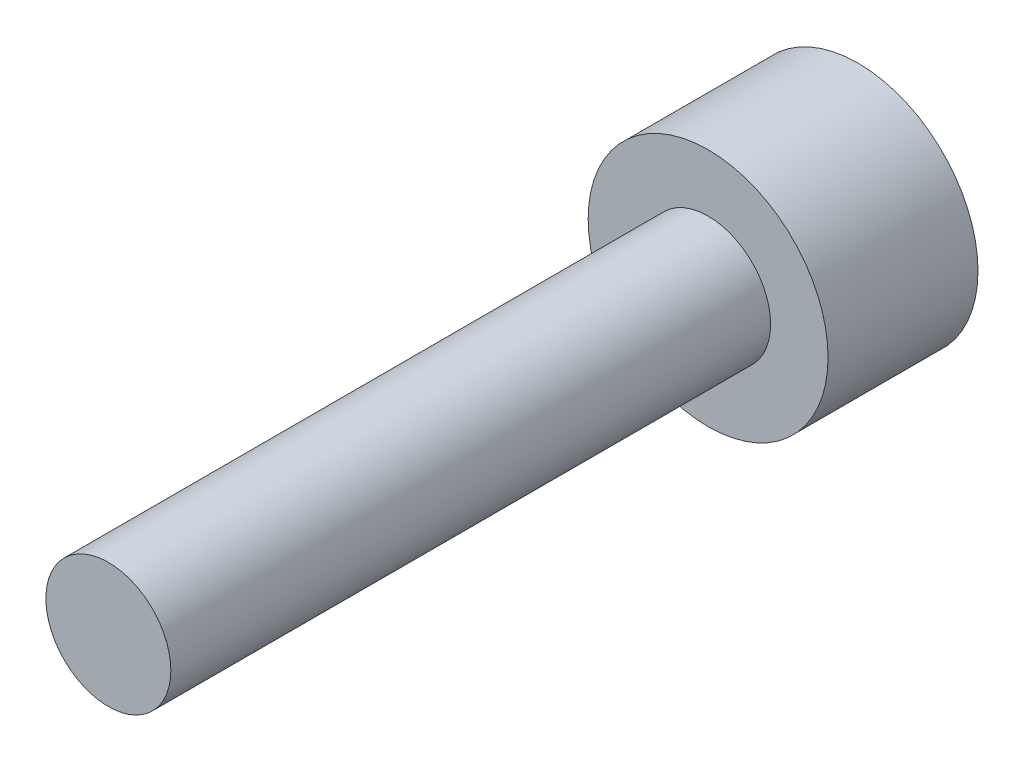
ISO-10303-21;
HEADER;
FILE_DESCRIPTION(('STEP AP214'),'2;1');
FILE_NAME('part.step','',(''),(''),'','','');
FILE_SCHEMA(('AUTOMOTIVE_DESIGN { 1 0 10303 214 1 1 1 1 }'));
ENDSEC;
DATA;
#1=APPLICATION_CONTEXT('core data for automotive mechanical design processes');
#2=APPLICATION_PROTOCOL_DEFINITION('international standard','automotive_design',2000,#1);
#3=PRODUCT_CONTEXT('',#1,'mechanical');
#4=PRODUCT('Part','Part','',(#3));
#5=PRODUCT_RELATED_PRODUCT_CATEGORY('part','',(#4));
#6=PRODUCT_DEFINITION_FORMATION('','',#4);
#7=PRODUCT_DEFINITION_CONTEXT('part definition',#1,'design');
#8=PRODUCT_DEFINITION('design','',#6,#7);
#9=PRODUCT_DEFINITION_SHAPE('','',#8);
#10=(LENGTH_UNIT() NAMED_UNIT(*) SI_UNIT(.MILLI.,.METRE.));
#11=(NAMED_UNIT(*) PLANE_ANGLE_UNIT() SI_UNIT($,.RADIAN.));
#12=(NAMED_UNIT(*) SI_UNIT($,.STERADIAN.) SOLID_ANGLE_UNIT());
#13=UNCERTAINTY_MEASURE_WITH_UNIT(LENGTH_MEASURE(1.E-05),#10,'distance_accuracy_value','');
#14=(GEOMETRIC_REPRESENTATION_CONTEXT(3) GLOBAL_UNCERTAINTY_ASSIGNED_CONTEXT((#13)) GLOBAL_UNIT_ASSIGNED_CONTEXT((#10,
#11,#12)) REPRESENTATION_CONTEXT('',''));
#15=CARTESIAN_POINT('',(0.,0.,0.));
#16=DIRECTION('',(0.,0.,1.));
#17=DIRECTION('',(1.,0.,0.));
#18=AXIS2_PLACEMENT_3D('',#15,#16,#17);
#19=CARTESIAN_POINT('',(0.,0.,9.525));
#20=DIRECTION('',(0.,0.,1.));
#21=DIRECTION('',(1.,0.,0.));
#22=AXIS2_PLACEMENT_3D('',#19,#20,#21);
#23=PLANE('',#22);
#24=CARTESIAN_POINT('',(0.,0.,9.525));
#25=DIRECTION('',(0.,0.,1.));
#26=DIRECTION('',(1.,0.,0.));
#27=AXIS2_PLACEMENT_3D('',#24,#25,#26);
#28=CIRCLE('',#27,7.62);
#29=CARTESIAN_POINT('',(-7.62,0.,9.525));
#30=VERTEX_POINT('',#29);
#31=EDGE_CURVE('E10',#30,#30,#28,.T.);
#32=ORIENTED_EDGE('',*,*,#31,.T.);
#33=EDGE_LOOP('',(#32));
#34=FACE_BOUND('',#33,.T.);
#35=CARTESIAN_POINT('',(0.,0.,9.525));
#36=DIRECTION('',(0.,0.,1.));
#37=DIRECTION('',(1.,0.,0.));
#38=AXIS2_PLACEMENT_3D('',#35,#36,#37);
#39=CIRCLE('',#38,3.96875);
#40=CARTESIAN_POINT('',(3.96875,0.,9.525));
#41=VERTEX_POINT('',#40);
#42=EDGE_CURVE('E45',#41,#41,#39,.F.);
#43=ORIENTED_EDGE('',*,*,#42,.T.);
#44=EDGE_LOOP('',(#43));
#45=FACE_BOUND('',#44,.T.);
#46=ADVANCED_FACE('F32',(#34,#45),#23,.T.);
#47=CARTESIAN_POINT('',(0.,0.,9.525));
#48=DIRECTION('',(0.,0.,-1.));
#49=DIRECTION('',(-1.,0.,0.));
#50=AXIS2_PLACEMENT_3D('',#47,#48,#49);
#51=CYLINDRICAL_SURFACE('',#50,7.62);
#52=CARTESIAN_POINT('',(0.,0.,0.));
#53=DIRECTION('',(0.,0.,1.));
#54=DIRECTION('',(1.,0.,0.));
#55=AXIS2_PLACEMENT_3D('',#52,#53,#54);
#56=CIRCLE('',#55,7.62);
#57=CARTESIAN_POINT('',(-7.62,0.,0.));
#58=VERTEX_POINT('',#57);
#59=EDGE_CURVE('E40',#58,#58,#56,.T.);
#60=CARTESIAN_POINT('',(-7.62,0.,9.525));
#61=CARTESIAN_POINT('',(-7.62,0.,9.42578125));
#62=CARTESIAN_POINT('',(-7.62,0.,9.3265625));
#63=CARTESIAN_POINT('',(-7.62,0.,9.128125));
#64=CARTESIAN_POINT('',(-7.62,0.,9.02890625));
#65=CARTESIAN_POINT('',(-7.62,0.,8.83046875));
#66=CARTESIAN_POINT('',(-7.62,0.,8.73125));
#67=CARTESIAN_POINT('',(-7.62,0.,8.5328125));
#68=CARTESIAN_POINT('',(-7.62,0.,8.43359375));
#69=CARTESIAN_POINT('',(-7.62,0.,8.23515625));
#70=CARTESIAN_POINT('',(-7.62,0.,8.1359375));
#71=CARTESIAN_POINT('',(-7.62,0.,7.9375));
#72=CARTESIAN_POINT('',(-7.62,0.,7.83828125));
#73=CARTESIAN_POINT('',(-7.62,0.,7.63984375));
#74=CARTESIAN_POINT('',(-7.62,0.,7.540625));
#75=CARTESIAN_POINT('',(-7.62,0.,7.3421875));
#76=CARTESIAN_POINT('',(-7.62,0.,7.24296875));
#77=CARTESIAN_POINT('',(-7.62,0.,7.04453125));
#78=CARTESIAN_POINT('',(-7.62,0.,6.9453125));
#79=CARTESIAN_POINT('',(-7.62,0.,6.746875));
#80=CARTESIAN_POINT('',(-7.62,0.,6.64765625));
#81=CARTESIAN_POINT('',(-7.62,0.,6.44921875));
#82=CARTESIAN_POINT('',(-7.62,0.,6.35));
#83=CARTESIAN_POINT('',(-7.62,0.,6.1515625));
#84=CARTESIAN_POINT('',(-7.62,0.,6.05234375));
#85=CARTESIAN_POINT('',(-7.62,0.,5.85390625));
#86=CARTESIAN_POINT('',(-7.62,0.,5.7546875));
#87=CARTESIAN_POINT('',(-7.62,0.,5.55625));
#88=CARTESIAN_POINT('',(-7.62,0.,5.45703125));
#89=CARTESIAN_POINT('',(-7.62,0.,5.25859375));
#90=CARTESIAN_POINT('',(-7.62,0.,5.159375));
#91=CARTESIAN_POINT('',(-7.62,0.,4.9609375));
#92=CARTESIAN_POINT('',(-7.62,0.,4.86171875));
#93=CARTESIAN_POINT('',(-7.62,0.,4.66328125));
#94=CARTESIAN_POINT('',(-7.62,0.,4.5640625));
#95=CARTESIAN_POINT('',(-7.62,0.,4.365625));
#96=CARTESIAN_POINT('',(-7.62,0.,4.26640625));
#97=CARTESIAN_POINT('',(-7.62,0.,4.06796875));
#98=CARTESIAN_POINT('',(-7.62,0.,3.96875));
#99=CARTESIAN_POINT('',(-7.62,0.,3.7703125));
#100=CARTESIAN_POINT('',(-7.62,0.,3.67109375));
#101=CARTESIAN_POINT('',(-7.62,0.,3.47265625));
#102=CARTESIAN_POINT('',(-7.62,0.,3.3734375));
#103=CARTESIAN_POINT('',(-7.62,0.,3.175));
#104=CARTESIAN_POINT('',(-7.62,0.,3.07578125));
#105=CARTESIAN_POINT('',(-7.62,0.,2.87734375));
#106=CARTESIAN_POINT('',(-7.62,0.,2.778125));
#107=CARTESIAN_POINT('',(-7.62,0.,2.5796875));
#108=CARTESIAN_POINT('',(-7.62,0.,2.48046875));
#109=CARTESIAN_POINT('',(-7.62,0.,2.28203125));
#110=CARTESIAN_POINT('',(-7.62,0.,2.1828125));
#111=CARTESIAN_POINT('',(-7.62,0.,1.984375));
#112=CARTESIAN_POINT('',(-7.62,0.,1.88515625));
#113=CARTESIAN_POINT('',(-7.62,0.,1.68671875));
#114=CARTESIAN_POINT('',(-7.62,0.,1.5875));
#115=CARTESIAN_POINT('',(-7.62,0.,1.3890625));
#116=CARTESIAN_POINT('',(-7.62,0.,1.28984375));
#117=CARTESIAN_POINT('',(-7.62,0.,1.09140625));
#118=CARTESIAN_POINT('',(-7.62,0.,0.992187500000001));
#119=CARTESIAN_POINT('',(-7.62,0.,0.793750000000001));
#120=CARTESIAN_POINT('',(-7.62,0.,0.69453125));
#121=CARTESIAN_POINT('',(-7.62,0.,0.49609375));
#122=CARTESIAN_POINT('',(-7.62,0.,0.396875));
#123=CARTESIAN_POINT('',(-7.62,0.,0.1984375));
#124=CARTESIAN_POINT('',(-7.62,0.,0.0992187500000001));
#125=CARTESIAN_POINT('',(-7.62,0.,0.));
#126=B_SPLINE_CURVE_WITH_KNOTS('',3,(#60,#61,#62,#63,#64,#65,#66,#67,#68,#69,#70,#71,#72,#73,
#74,#75,#76,#77,#78,#79,#80,#81,#82,#83,#84,#85,#86,#87,#88,#89,#90,#91,#92,#93,#94,#95,#96,#97,
#98,#99,#100,#101,#102,#103,#104,#105,#106,#107,#108,#109,#110,#111,#112,#113,#114,#115,#116,
#117,#118,#119,#120,#121,#122,#123,#124,#125),.UNSPECIFIED.,.F.,.F.,(4,2,2,2,2,2,2,2,2,2,2,2,2,
2,2,2,2,2,2,2,2,2,2,2,2,2,2,2,2,2,2,2,4),(0.,0.29765625,0.5953125,0.892968750000001,1.190625,
1.48828125,1.7859375,2.08359375,2.38125,2.67890625,2.9765625,3.27421875,3.571875,3.86953125,
4.1671875,4.46484375,4.7625,5.06015625,5.3578125,5.65546875,5.953125,6.25078125,6.5484375,
6.84609375,7.14375,7.44140625,7.7390625,8.03671875,8.334375,8.63203125,8.9296875,9.22734375,
9.525),.UNSPECIFIED.);
#127=EDGE_CURVE('BSEAM34',#30,#58,#126,.T.);
#128=ORIENTED_EDGE('',*,*,#31,.F.);
#129=ORIENTED_EDGE('',*,*,#59,.T.);
#130=ORIENTED_EDGE('',*,*,#127,.T.);
#131=ORIENTED_EDGE('',*,*,#127,.F.);
#132=EDGE_LOOP('',(#128,#130,#129,#131));
#133=FACE_BOUND('',#132,.T.);
#134=ADVANCED_FACE('F34',(#133),#51,.T.);
#135=CARTESIAN_POINT('',(0.,0.,0.));
#136=DIRECTION('',(0.,0.,1.));
#137=DIRECTION('',(1.,0.,0.));
#138=AXIS2_PLACEMENT_3D('',#135,#136,#137);
#139=PLANE('',#138);
#140=CARTESIAN_POINT('',(0.,0.,0.));
#141=DIRECTION('',(0.,0.,-1.));
#142=DIRECTION('',(-1.,0.,0.));
#143=AXIS2_PLACEMENT_3D('',#140,#141,#142);
#144=CIRCLE('',#143,3.175);
#145=CARTESIAN_POINT('',(-3.175,0.,0.));
#146=VERTEX_POINT('',#145);
#147=EDGE_CURVE('E58',#146,#146,#144,.T.);
#148=ORIENTED_EDGE('',*,*,#147,.F.);
#149=EDGE_LOOP('',(#148));
#150=FACE_BOUND('',#149,.T.);
#151=ORIENTED_EDGE('',*,*,#59,.F.);
#152=EDGE_LOOP('',(#151));
#153=FACE_BOUND('',#152,.T.);
#154=ADVANCED_FACE('F92',(#150,#153),#139,.F.);
#155=CARTESIAN_POINT('',(0.,0.,47.625));
#156=DIRECTION('',(0.,0.,-1.));
#157=DIRECTION('',(-1.,0.,0.));
#158=AXIS2_PLACEMENT_3D('',#155,#156,#157);
#159=CYLINDRICAL_SURFACE('',#158,3.96875);
#160=ORIENTED_EDGE('',*,*,#42,.F.);
#161=EDGE_LOOP('',(#160));
#162=FACE_BOUND('',#161,.T.);
#163=CARTESIAN_POINT('',(0.,0.,47.625));
#164=DIRECTION('',(0.,0.,1.));
#165=DIRECTION('',(1.,0.,0.));
#166=AXIS2_PLACEMENT_3D('',#163,#164,#165);
#167=CIRCLE('',#166,3.96875);
#168=CARTESIAN_POINT('',(3.96875,0.,47.625));
#169=VERTEX_POINT('',#168);
#170=EDGE_CURVE('E48',#169,#169,#167,.T.);
#171=ORIENTED_EDGE('',*,*,#170,.F.);
#172=EDGE_LOOP('',(#171));
#173=FACE_BOUND('',#172,.T.);
#174=ADVANCED_FACE('F95',(#162,#173),#159,.T.);
#175=CARTESIAN_POINT('',(0.,0.,47.625));
#176=DIRECTION('',(0.,0.,1.));
#177=DIRECTION('',(1.,0.,0.));
#178=AXIS2_PLACEMENT_3D('',#175,#176,#177);
#179=PLANE('',#178);
#180=ORIENTED_EDGE('',*,*,#170,.T.);
#181=EDGE_LOOP('',(#180));
#182=FACE_BOUND('',#181,.T.);
#183=ADVANCED_FACE('F84',(#182),#179,.T.);
#184=CARTESIAN_POINT('',(0.,0.,4.7625));
#185=DIRECTION('',(0.,0.,-1.));
#186=DIRECTION('',(-1.,0.,0.));
#187=AXIS2_PLACEMENT_3D('',#184,#185,#186);
#188=CYLINDRICAL_SURFACE('',#187,3.175);
#189=CARTESIAN_POINT('',(0.,0.,4.7625));
#190=DIRECTION('',(0.,0.,-1.));
#191=DIRECTION('',(-1.,0.,0.));
#192=AXIS2_PLACEMENT_3D('',#189,#190,#191);
#193=CIRCLE('',#192,3.175);
#194=CARTESIAN_POINT('',(-3.175,0.,4.7625));
#195=VERTEX_POINT('',#194);
#196=EDGE_CURVE('E54',#195,#195,#193,.T.);
#197=CARTESIAN_POINT('',(-3.175,0.,4.7625));
#198=CARTESIAN_POINT('',(-3.175,0.,4.712890625));
#199=CARTESIAN_POINT('',(-3.175,0.,4.66328125));
#200=CARTESIAN_POINT('',(-3.175,0.,4.5640625));
#201=CARTESIAN_POINT('',(-3.175,0.,4.514453125));
#202=CARTESIAN_POINT('',(-3.175,0.,4.415234375));
#203=CARTESIAN_POINT('',(-3.175,0.,4.365625));
#204=CARTESIAN_POINT('',(-3.175,0.,4.26640625));
#205=CARTESIAN_POINT('',(-3.175,0.,4.216796875));
#206=CARTESIAN_POINT('',(-3.175,0.,4.117578125));
#207=CARTESIAN_POINT('',(-3.175,0.,4.06796875));
#208=CARTESIAN_POINT('',(-3.175,0.,3.96875));
#209=CARTESIAN_POINT('',(-3.175,0.,3.919140625));
#210=CARTESIAN_POINT('',(-3.175,0.,3.819921875));
#211=CARTESIAN_POINT('',(-3.175,0.,3.7703125));
#212=CARTESIAN_POINT('',(-3.175,0.,3.67109375));
#213=CARTESIAN_POINT('',(-3.175,0.,3.621484375));
#214=CARTESIAN_POINT('',(-3.175,0.,3.522265625));
#215=CARTESIAN_POINT('',(-3.175,0.,3.47265625));
#216=CARTESIAN_POINT('',(-3.175,0.,3.3734375));
#217=CARTESIAN_POINT('',(-3.175,0.,3.323828125));
#218=CARTESIAN_POINT('',(-3.175,0.,3.224609375));
#219=CARTESIAN_POINT('',(-3.175,0.,3.175));
#220=CARTESIAN_POINT('',(-3.175,0.,3.07578125));
#221=CARTESIAN_POINT('',(-3.175,0.,3.026171875));
#222=CARTESIAN_POINT('',(-3.175,0.,2.926953125));
#223=CARTESIAN_POINT('',(-3.175,0.,2.87734375));
#224=CARTESIAN_POINT('',(-3.175,0.,2.778125));
#225=CARTESIAN_POINT('',(-3.175,0.,2.728515625));
#226=CARTESIAN_POINT('',(-3.175,0.,2.629296875));
#227=CARTESIAN_POINT('',(-3.175,0.,2.5796875));
#228=CARTESIAN_POINT('',(-3.175,0.,2.48046875));
#229=CARTESIAN_POINT('',(-3.175,0.,2.430859375));
#230=CARTESIAN_POINT('',(-3.175,0.,2.331640625));
#231=CARTESIAN_POINT('',(-3.175,0.,2.28203125));
#232=CARTESIAN_POINT('',(-3.175,0.,2.1828125));
#233=CARTESIAN_POINT('',(-3.175,0.,2.133203125));
#234=CARTESIAN_POINT('',(-3.175,0.,2.033984375));
#235=CARTESIAN_POINT('',(-3.175,0.,1.984375));
#236=CARTESIAN_POINT('',(-3.175,0.,1.88515625));
#237=CARTESIAN_POINT('',(-3.175,0.,1.835546875));
#238=CARTESIAN_POINT('',(-3.175,0.,1.736328125));
#239=CARTESIAN_POINT('',(-3.175,0.,1.68671875));
#240=CARTESIAN_POINT('',(-3.175,0.,1.5875));
#241=CARTESIAN_POINT('',(-3.175,0.,1.537890625));
#242=CARTESIAN_POINT('',(-3.175,0.,1.438671875));
#243=CARTESIAN_POINT('',(-3.175,0.,1.3890625));
#244=CARTESIAN_POINT('',(-3.175,0.,1.28984375));
#245=CARTESIAN_POINT('',(-3.175,0.,1.240234375));
#246=CARTESIAN_POINT('',(-3.175,0.,1.141015625));
#247=CARTESIAN_POINT('',(-3.175,0.,1.09140625));
#248=CARTESIAN_POINT('',(-3.175,0.,0.9921875));
#249=CARTESIAN_POINT('',(-3.175,0.,0.942578125));
#250=CARTESIAN_POINT('',(-3.175,0.,0.843359375));
#251=CARTESIAN_POINT('',(-3.175,0.,0.79375));
#252=CARTESIAN_POINT('',(-3.175,0.,0.69453125));
#253=CARTESIAN_POINT('',(-3.175,0.,0.644921875));
#254=CARTESIAN_POINT('',(-3.175,0.,0.545703125));
#255=CARTESIAN_POINT('',(-3.175,0.,0.49609375));
#256=CARTESIAN_POINT('',(-3.175,0.,0.396875));
#257=CARTESIAN_POINT('',(-3.175,0.,0.347265625));
#258=CARTESIAN_POINT('',(-3.175,0.,0.248046875));
#259=CARTESIAN_POINT('',(-3.175,0.,0.1984375));
#260=CARTESIAN_POINT('',(-3.175,0.,0.09921875));
#261=CARTESIAN_POINT('',(-3.175,0.,0.049609375));
#262=CARTESIAN_POINT('',(-3.175,0.,0.));
#263=B_SPLINE_CURVE_WITH_KNOTS('',3,(#197,#198,#199,#200,#201,#202,#203,#204,#205,#206,#207,
#208,#209,#210,#211,#212,#213,#214,#215,#216,#217,#218,#219,#220,#221,#222,#223,#224,#225,#226,
#227,#228,#229,#230,#231,#232,#233,#234,#235,#236,#237,#238,#239,#240,#241,#242,#243,#244,#245,
#246,#247,#248,#249,#250,#251,#252,#253,#254,#255,#256,#257,#258,#259,#260,#261,#262),
.UNSPECIFIED.,.F.,.F.,(4,2,2,2,2,2,2,2,2,2,2,2,2,2,2,2,2,2,2,2,2,2,2,2,2,2,2,2,2,2,2,2,4),(0.,
0.148828125,0.29765625,0.446484375,0.5953125,0.744140625,0.892968750000001,1.041796875,1.190625,
1.339453125,1.48828125,1.637109375,1.7859375,1.934765625,2.08359375,2.232421875,2.38125,
2.530078125,2.67890625,2.827734375,2.9765625,3.125390625,3.27421875,3.423046875,3.571875,
3.720703125,3.86953125,4.018359375,4.1671875,4.316015625,4.46484375,4.613671875,4.7625),.UNSPECIFIED.);
#264=EDGE_CURVE('BSEAM76',#195,#146,#263,.T.);
#265=ORIENTED_EDGE('',*,*,#196,.F.);
#266=ORIENTED_EDGE('',*,*,#147,.T.);
#267=ORIENTED_EDGE('',*,*,#264,.T.);
#268=ORIENTED_EDGE('',*,*,#264,.F.);
#269=EDGE_LOOP('',(#265,#267,#266,#268));
#270=FACE_BOUND('',#269,.T.);
#271=ADVANCED_FACE('F76',(#270),#188,.F.);
#272=CARTESIAN_POINT('',(0.,0.,4.7625));
#273=DIRECTION('',(0.,0.,-1.));
#274=DIRECTION('',(-1.,0.,0.));
#275=AXIS2_PLACEMENT_3D('',#272,#273,#274);
#276=PLANE('',#275);
#277=CARTESIAN_POINT('',(0.,0.,4.7625));
#278=DIRECTION('',(0.,0.,-1.));
#279=DIRECTION('',(-1.,0.,0.));
#280=AXIS2_PLACEMENT_3D('',#277,#278,#279);
#281=CIRCLE('',#280,1.5875);
#282=CARTESIAN_POINT('',(-1.5875,0.,4.7625));
#283=VERTEX_POINT('',#282);
#284=EDGE_CURVE('E36',#283,#283,#281,.T.);
#285=ORIENTED_EDGE('',*,*,#284,.F.);
#286=EDGE_LOOP('',(#285));
#287=FACE_BOUND('',#286,.T.);
#288=ORIENTED_EDGE('',*,*,#196,.T.);
#289=EDGE_LOOP('',(#288));
#290=FACE_BOUND('',#289,.T.);
#291=ADVANCED_FACE('F74',(#287,#290),#276,.T.);
#292=CARTESIAN_POINT('',(0.,0.,13.589));
#293=DIRECTION('',(0.,0.,-1.));
#294=DIRECTION('',(-1.,0.,0.));
#295=AXIS2_PLACEMENT_3D('',#292,#293,#294);
#296=CYLINDRICAL_SURFACE('',#295,1.5875);
#297=ORIENTED_EDGE('',*,*,#284,.T.);
#298=EDGE_LOOP('',(#297));
#299=FACE_BOUND('',#298,.T.);
#300=CARTESIAN_POINT('',(0.,0.,13.589));
#301=DIRECTION('',(0.,0.,-1.));
#302=DIRECTION('',(-1.,0.,0.));
#303=AXIS2_PLACEMENT_3D('',#300,#301,#302);
#304=CIRCLE('',#303,1.5875);
#305=CARTESIAN_POINT('',(-1.5875,0.,13.589));
#306=VERTEX_POINT('',#305);
#307=EDGE_CURVE('E64',#306,#306,#304,.T.);
#308=ORIENTED_EDGE('',*,*,#307,.F.);
#309=EDGE_LOOP('',(#308));
#310=FACE_BOUND('',#309,.T.);
#311=ADVANCED_FACE('F71',(#299,#310),#296,.F.);
#312=CARTESIAN_POINT('',(0.,0.,13.589));
#313=DIRECTION('',(0.,0.,-1.));
#314=DIRECTION('',(-1.,0.,0.));
#315=AXIS2_PLACEMENT_3D('',#312,#313,#314);
#316=PLANE('',#315);
#317=ORIENTED_EDGE('',*,*,#307,.T.);
#318=EDGE_LOOP('',(#317));
#319=FACE_BOUND('',#318,.T.);
#320=ADVANCED_FACE('F82',(#319),#316,.T.);
#321=CLOSED_SHELL('',(#46,#134,#154,#174,#183,#271,#291,#311,#320));
#322=MANIFOLD_SOLID_BREP('B2',#321);
#323=ADVANCED_BREP_SHAPE_REPRESENTATION('',(#18,#322),#14);
#324=SHAPE_DEFINITION_REPRESENTATION(#9,#323);
ENDSEC;
END-ISO-10303-21;
